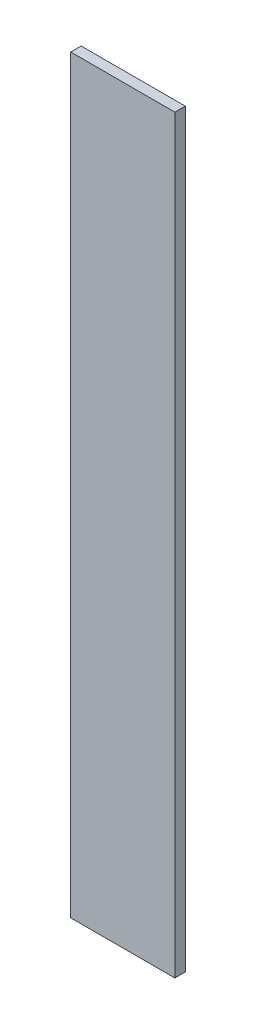
ISO-10303-21;
HEADER;
FILE_DESCRIPTION(('STEP AP214'),'2;1');
FILE_NAME('part.step','',(''),(''),'','','');
FILE_SCHEMA(('AUTOMOTIVE_DESIGN { 1 0 10303 214 1 1 1 1 }'));
ENDSEC;
DATA;
#1=APPLICATION_CONTEXT('core data for automotive mechanical design processes');
#2=APPLICATION_PROTOCOL_DEFINITION('international standard','automotive_design',2000,#1);
#3=PRODUCT_CONTEXT('',#1,'mechanical');
#4=PRODUCT('Part','Part','',(#3));
#5=PRODUCT_RELATED_PRODUCT_CATEGORY('part','',(#4));
#6=PRODUCT_DEFINITION_FORMATION('','',#4);
#7=PRODUCT_DEFINITION_CONTEXT('part definition',#1,'design');
#8=PRODUCT_DEFINITION('design','',#6,#7);
#9=PRODUCT_DEFINITION_SHAPE('','',#8);
#10=(LENGTH_UNIT() NAMED_UNIT(*) SI_UNIT(.MILLI.,.METRE.));
#11=(NAMED_UNIT(*) PLANE_ANGLE_UNIT() SI_UNIT($,.RADIAN.));
#12=(NAMED_UNIT(*) SI_UNIT($,.STERADIAN.) SOLID_ANGLE_UNIT());
#13=UNCERTAINTY_MEASURE_WITH_UNIT(LENGTH_MEASURE(1.E-05),#10,'distance_accuracy_value','');
#14=(GEOMETRIC_REPRESENTATION_CONTEXT(3) GLOBAL_UNCERTAINTY_ASSIGNED_CONTEXT((#13)) GLOBAL_UNIT_ASSIGNED_CONTEXT((#10,
#11,#12)) REPRESENTATION_CONTEXT('',''));
#15=CARTESIAN_POINT('',(0.,0.,0.));
#16=DIRECTION('',(0.,0.,1.));
#17=DIRECTION('',(1.,0.,0.));
#18=AXIS2_PLACEMENT_3D('',#15,#16,#17);
#19=CARTESIAN_POINT('',(-15.875,228.6,1.5875));
#20=DIRECTION('',(1.,0.,0.));
#21=DIRECTION('',(0.,0.,-1.));
#22=AXIS2_PLACEMENT_3D('',#19,#20,#21);
#23=PLANE('',#22);
#24=DIRECTION('',(0.,0.,1.));
#25=VECTOR('',#24,1.);
#26=CARTESIAN_POINT('',(-15.875,0.,1.5875));
#27=LINE('',#26,#25);
#28=CARTESIAN_POINT('',(-15.875,0.,-1.5875));
#29=VERTEX_POINT('',#28);
#30=CARTESIAN_POINT('',(-15.875,0.,1.5875));
#31=VERTEX_POINT('',#30);
#32=EDGE_CURVE('E98',#29,#31,#27,.T.);
#33=ORIENTED_EDGE('',*,*,#32,.T.);
#34=DIRECTION('',(0.,-1.,0.));
#35=VECTOR('',#34,1.);
#36=CARTESIAN_POINT('',(-15.875,228.6,1.5875));
#37=LINE('',#36,#35);
#38=CARTESIAN_POINT('',(-15.875,228.6,1.5875));
#39=VERTEX_POINT('',#38);
#40=EDGE_CURVE('E11',#39,#31,#37,.T.);
#41=ORIENTED_EDGE('',*,*,#40,.F.);
#42=DIRECTION('',(0.,0.,1.));
#43=VECTOR('',#42,1.);
#44=CARTESIAN_POINT('',(-15.875,228.6,1.5875));
#45=LINE('',#44,#43);
#46=CARTESIAN_POINT('',(-15.875,228.6,-1.5875));
#47=VERTEX_POINT('',#46);
#48=EDGE_CURVE('E86',#47,#39,#45,.T.);
#49=ORIENTED_EDGE('',*,*,#48,.F.);
#50=DIRECTION('',(0.,-1.,0.));
#51=VECTOR('',#50,1.);
#52=CARTESIAN_POINT('',(-15.875,228.6,-1.5875));
#53=LINE('',#52,#51);
#54=EDGE_CURVE('E94',#47,#29,#53,.T.);
#55=ORIENTED_EDGE('',*,*,#54,.T.);
#56=EDGE_LOOP('',(#33,#41,#49,#55));
#57=FACE_BOUND('',#56,.T.);
#58=ADVANCED_FACE('F35',(#57),#23,.F.);
#59=CARTESIAN_POINT('',(15.875,228.6,1.5875));
#60=DIRECTION('',(0.,0.,-1.));
#61=DIRECTION('',(-1.,0.,0.));
#62=AXIS2_PLACEMENT_3D('',#59,#60,#61);
#63=PLANE('',#62);
#64=DIRECTION('',(1.,0.,0.));
#65=VECTOR('',#64,1.);
#66=CARTESIAN_POINT('',(15.875,0.,1.5875));
#67=LINE('',#66,#65);
#68=CARTESIAN_POINT('',(15.875,0.,1.5875));
#69=VERTEX_POINT('',#68);
#70=EDGE_CURVE('E90',#31,#69,#67,.T.);
#71=ORIENTED_EDGE('',*,*,#70,.T.);
#72=DIRECTION('',(0.,-1.,0.));
#73=VECTOR('',#72,1.);
#74=CARTESIAN_POINT('',(15.875,228.6,1.5875));
#75=LINE('',#74,#73);
#76=CARTESIAN_POINT('',(15.875,228.6,1.5875));
#77=VERTEX_POINT('',#76);
#78=EDGE_CURVE('E43',#77,#69,#75,.T.);
#79=ORIENTED_EDGE('',*,*,#78,.F.);
#80=DIRECTION('',(1.,0.,0.));
#81=VECTOR('',#80,1.);
#82=CARTESIAN_POINT('',(15.875,228.6,1.5875));
#83=LINE('',#82,#81);
#84=EDGE_CURVE('E81',#39,#77,#83,.T.);
#85=ORIENTED_EDGE('',*,*,#84,.F.);
#86=ORIENTED_EDGE('',*,*,#40,.T.);
#87=EDGE_LOOP('',(#71,#79,#85,#86));
#88=FACE_BOUND('',#87,.T.);
#89=ADVANCED_FACE('F89',(#88),#63,.F.);
#90=CARTESIAN_POINT('',(15.875,228.6,1.5875));
#91=DIRECTION('',(-1.,0.,0.));
#92=DIRECTION('',(0.,0.,1.));
#93=AXIS2_PLACEMENT_3D('',#90,#91,#92);
#94=PLANE('',#93);
#95=DIRECTION('',(0.,0.,-1.));
#96=VECTOR('',#95,1.);
#97=CARTESIAN_POINT('',(15.875,0.,1.5875));
#98=LINE('',#97,#96);
#99=CARTESIAN_POINT('',(15.875,0.,-1.5875));
#100=VERTEX_POINT('',#99);
#101=EDGE_CURVE('E68',#69,#100,#98,.T.);
#102=ORIENTED_EDGE('',*,*,#101,.T.);
#103=DIRECTION('',(0.,-1.,0.));
#104=VECTOR('',#103,1.);
#105=CARTESIAN_POINT('',(15.875,228.6,-1.5875));
#106=LINE('',#105,#104);
#107=CARTESIAN_POINT('',(15.875,228.6,-1.5875));
#108=VERTEX_POINT('',#107);
#109=EDGE_CURVE('E91',#108,#100,#106,.T.);
#110=ORIENTED_EDGE('',*,*,#109,.F.);
#111=DIRECTION('',(0.,0.,-1.));
#112=VECTOR('',#111,1.);
#113=CARTESIAN_POINT('',(15.875,228.6,1.5875));
#114=LINE('',#113,#112);
#115=EDGE_CURVE('E84',#77,#108,#114,.T.);
#116=ORIENTED_EDGE('',*,*,#115,.F.);
#117=ORIENTED_EDGE('',*,*,#78,.T.);
#118=EDGE_LOOP('',(#102,#110,#116,#117));
#119=FACE_BOUND('',#118,.T.);
#120=ADVANCED_FACE('F92',(#119),#94,.F.);
#121=CARTESIAN_POINT('',(15.875,228.6,-1.5875));
#122=DIRECTION('',(0.,0.,1.));
#123=DIRECTION('',(1.,0.,0.));
#124=AXIS2_PLACEMENT_3D('',#121,#122,#123);
#125=PLANE('',#124);
#126=DIRECTION('',(-1.,0.,0.));
#127=VECTOR('',#126,1.);
#128=CARTESIAN_POINT('',(15.875,0.,-1.5875));
#129=LINE('',#128,#127);
#130=EDGE_CURVE('E74',#100,#29,#129,.T.);
#131=ORIENTED_EDGE('',*,*,#130,.T.);
#132=ORIENTED_EDGE('',*,*,#54,.F.);
#133=DIRECTION('',(-1.,0.,0.));
#134=VECTOR('',#133,1.);
#135=CARTESIAN_POINT('',(15.875,228.6,-1.5875));
#136=LINE('',#135,#134);
#137=EDGE_CURVE('E51',#108,#47,#136,.T.);
#138=ORIENTED_EDGE('',*,*,#137,.F.);
#139=ORIENTED_EDGE('',*,*,#109,.T.);
#140=EDGE_LOOP('',(#131,#132,#138,#139));
#141=FACE_BOUND('',#140,.T.);
#142=ADVANCED_FACE('F105',(#141),#125,.F.);
#143=CARTESIAN_POINT('',(0.,228.6,0.));
#144=DIRECTION('',(0.,1.,0.));
#145=DIRECTION('',(0.,0.,1.));
#146=AXIS2_PLACEMENT_3D('',#143,#144,#145);
#147=PLANE('',#146);
#148=ORIENTED_EDGE('',*,*,#48,.T.);
#149=ORIENTED_EDGE('',*,*,#84,.T.);
#150=ORIENTED_EDGE('',*,*,#115,.T.);
#151=ORIENTED_EDGE('',*,*,#137,.T.);
#152=EDGE_LOOP('',(#148,#149,#150,#151));
#153=FACE_BOUND('',#152,.T.);
#154=ADVANCED_FACE('F82',(#153),#147,.T.);
#155=CARTESIAN_POINT('',(0.,0.,0.));
#156=DIRECTION('',(0.,1.,0.));
#157=DIRECTION('',(0.,0.,1.));
#158=AXIS2_PLACEMENT_3D('',#155,#156,#157);
#159=PLANE('',#158);
#160=ORIENTED_EDGE('',*,*,#32,.F.);
#161=ORIENTED_EDGE('',*,*,#130,.F.);
#162=ORIENTED_EDGE('',*,*,#101,.F.);
#163=ORIENTED_EDGE('',*,*,#70,.F.);
#164=EDGE_LOOP('',(#160,#161,#162,#163));
#165=FACE_BOUND('',#164,.T.);
#166=ADVANCED_FACE('F108',(#165),#159,.F.);
#167=CLOSED_SHELL('',(#58,#89,#120,#142,#154,#166));
#168=MANIFOLD_SOLID_BREP('B2',#167);
#169=ADVANCED_BREP_SHAPE_REPRESENTATION('',(#18,#168),#14);
#170=SHAPE_DEFINITION_REPRESENTATION(#9,#169);
ENDSEC;
END-ISO-10303-21;
